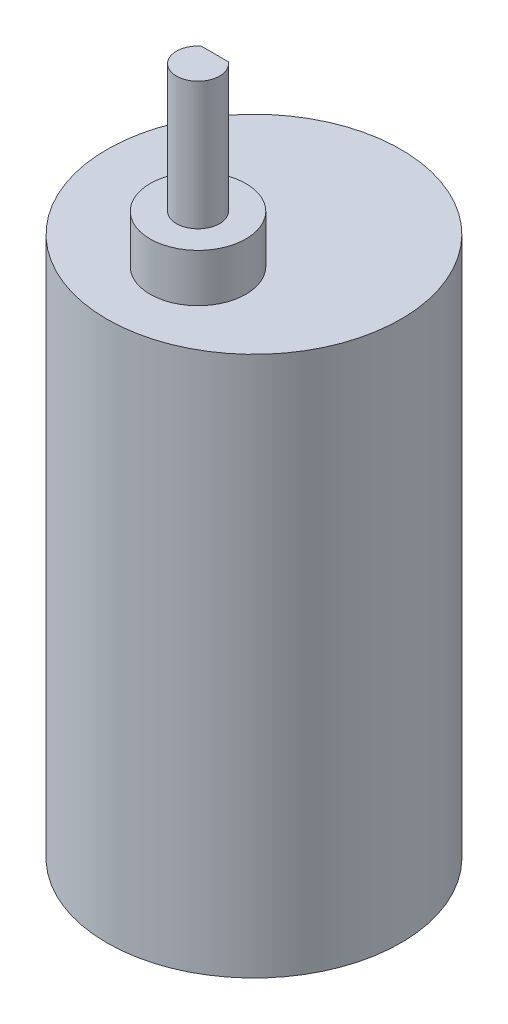
ISO-10303-21;
HEADER;
FILE_DESCRIPTION(('STEP AP214'),'2;1');
FILE_NAME('part.step','',(''),(''),'','','');
FILE_SCHEMA(('AUTOMOTIVE_DESIGN { 1 0 10303 214 1 1 1 1 }'));
ENDSEC;
DATA;
#1=APPLICATION_CONTEXT('core data for automotive mechanical design processes');
#2=APPLICATION_PROTOCOL_DEFINITION('international standard','automotive_design',2000,#1);
#3=PRODUCT_CONTEXT('',#1,'mechanical');
#4=PRODUCT('Part','Part','',(#3));
#5=PRODUCT_RELATED_PRODUCT_CATEGORY('part','',(#4));
#6=PRODUCT_DEFINITION_FORMATION('','',#4);
#7=PRODUCT_DEFINITION_CONTEXT('part definition',#1,'design');
#8=PRODUCT_DEFINITION('design','',#6,#7);
#9=PRODUCT_DEFINITION_SHAPE('','',#8);
#10=(LENGTH_UNIT() NAMED_UNIT(*) SI_UNIT(.MILLI.,.METRE.));
#11=(NAMED_UNIT(*) PLANE_ANGLE_UNIT() SI_UNIT($,.RADIAN.));
#12=(NAMED_UNIT(*) SI_UNIT($,.STERADIAN.) SOLID_ANGLE_UNIT());
#13=UNCERTAINTY_MEASURE_WITH_UNIT(LENGTH_MEASURE(1.E-05),#10,'distance_accuracy_value','');
#14=(GEOMETRIC_REPRESENTATION_CONTEXT(3) GLOBAL_UNCERTAINTY_ASSIGNED_CONTEXT((#13)) GLOBAL_UNIT_ASSIGNED_CONTEXT((#10,
#11,#12)) REPRESENTATION_CONTEXT('',''));
#15=CARTESIAN_POINT('',(0.,0.,0.));
#16=DIRECTION('',(0.,0.,1.));
#17=DIRECTION('',(1.,0.,0.));
#18=AXIS2_PLACEMENT_3D('',#15,#16,#17);
#19=CARTESIAN_POINT('',(0.,73.6,7.));
#20=DIRECTION('',(0.,1.,0.));
#21=DIRECTION('',(0.,0.,1.));
#22=AXIS2_PLACEMENT_3D('',#19,#20,#21);
#23=PLANE('',#22);
#24=CARTESIAN_POINT('',(0.,73.6,7.));
#25=DIRECTION('',(0.,1.,0.));
#26=DIRECTION('',(0.,0.,1.));
#27=AXIS2_PLACEMENT_3D('',#24,#25,#26);
#28=CIRCLE('',#27,6.);
#29=CARTESIAN_POINT('',(0.,73.6,13.));
#30=VERTEX_POINT('',#29);
#31=EDGE_CURVE('E85',#30,#30,#28,.T.);
#32=ORIENTED_EDGE('',*,*,#31,.T.);
#33=EDGE_LOOP('',(#32));
#34=FACE_BOUND('',#33,.T.);
#35=DIRECTION('',(1.,0.,0.));
#36=VECTOR('',#35,1.);
#37=CARTESIAN_POINT('',(0.,73.6,4.9));
#38=LINE('',#37,#36);
#39=CARTESIAN_POINT('',(-1.69705627484771,73.6,4.9));
#40=VERTEX_POINT('',#39);
#41=CARTESIAN_POINT('',(1.69705627484771,73.6,4.9));
#42=VERTEX_POINT('',#41);
#43=EDGE_CURVE('E48',#40,#42,#38,.T.);
#44=ORIENTED_EDGE('',*,*,#43,.T.);
#45=CARTESIAN_POINT('',(0.,73.6,7.));
#46=DIRECTION('',(0.,1.,0.));
#47=DIRECTION('',(0.,0.,1.));
#48=AXIS2_PLACEMENT_3D('',#45,#46,#47);
#49=CIRCLE('',#48,2.7);
#50=EDGE_CURVE('E11',#42,#40,#49,.F.);
#51=ORIENTED_EDGE('',*,*,#50,.T.);
#52=EDGE_LOOP('',(#44,#51));
#53=FACE_BOUND('',#52,.T.);
#54=ADVANCED_FACE('F39',(#34,#53),#23,.T.);
#55=CARTESIAN_POINT('',(0.,67.6,0.));
#56=DIRECTION('',(0.,-1.,0.));
#57=DIRECTION('',(0.,0.,-1.));
#58=AXIS2_PLACEMENT_3D('',#55,#56,#57);
#59=CYLINDRICAL_SURFACE('',#58,18.4);
#60=CARTESIAN_POINT('',(0.,67.6,0.));
#61=DIRECTION('',(0.,1.,0.));
#62=DIRECTION('',(0.,0.,1.));
#63=AXIS2_PLACEMENT_3D('',#60,#61,#62);
#64=CIRCLE('',#63,18.4);
#65=CARTESIAN_POINT('',(0.,67.6,18.4));
#66=VERTEX_POINT('',#65);
#67=EDGE_CURVE('E93',#66,#66,#64,.T.);
#68=ORIENTED_EDGE('',*,*,#67,.F.);
#69=EDGE_LOOP('',(#68));
#70=FACE_BOUND('',#69,.T.);
#71=CARTESIAN_POINT('',(0.,0.,0.));
#72=DIRECTION('',(0.,1.,0.));
#73=DIRECTION('',(0.,0.,1.));
#74=AXIS2_PLACEMENT_3D('',#71,#72,#73);
#75=CIRCLE('',#74,18.4);
#76=CARTESIAN_POINT('',(0.,0.,18.4));
#77=VERTEX_POINT('',#76);
#78=EDGE_CURVE('E91',#77,#77,#75,.T.);
#79=ORIENTED_EDGE('',*,*,#78,.T.);
#80=EDGE_LOOP('',(#79));
#81=FACE_BOUND('',#80,.T.);
#82=ADVANCED_FACE('F41',(#70,#81),#59,.T.);
#83=CARTESIAN_POINT('',(0.,67.6,0.));
#84=DIRECTION('',(0.,1.,0.));
#85=DIRECTION('',(0.,0.,1.));
#86=AXIS2_PLACEMENT_3D('',#83,#84,#85);
#87=PLANE('',#86);
#88=CARTESIAN_POINT('',(0.,67.6,7.));
#89=DIRECTION('',(0.,1.,0.));
#90=DIRECTION('',(0.,0.,1.));
#91=AXIS2_PLACEMENT_3D('',#88,#89,#90);
#92=CIRCLE('',#91,6.);
#93=CARTESIAN_POINT('',(0.,67.6,13.));
#94=VERTEX_POINT('',#93);
#95=EDGE_CURVE('E80',#94,#94,#92,.T.);
#96=ORIENTED_EDGE('',*,*,#95,.F.);
#97=EDGE_LOOP('',(#96));
#98=FACE_BOUND('',#97,.T.);
#99=ORIENTED_EDGE('',*,*,#67,.T.);
#100=EDGE_LOOP('',(#99));
#101=FACE_BOUND('',#100,.T.);
#102=ADVANCED_FACE('F107',(#98,#101),#87,.T.);
#103=CARTESIAN_POINT('',(0.,0.,0.));
#104=DIRECTION('',(0.,1.,0.));
#105=DIRECTION('',(0.,0.,1.));
#106=AXIS2_PLACEMENT_3D('',#103,#104,#105);
#107=PLANE('',#106);
#108=ORIENTED_EDGE('',*,*,#78,.F.);
#109=EDGE_LOOP('',(#108));
#110=FACE_BOUND('',#109,.T.);
#111=ADVANCED_FACE('F115',(#110),#107,.F.);
#112=CARTESIAN_POINT('',(0.,73.6,7.));
#113=DIRECTION('',(0.,-1.,0.));
#114=DIRECTION('',(0.,0.,-1.));
#115=AXIS2_PLACEMENT_3D('',#112,#113,#114);
#116=CYLINDRICAL_SURFACE('',#115,6.);
#117=ORIENTED_EDGE('',*,*,#31,.F.);
#118=EDGE_LOOP('',(#117));
#119=FACE_BOUND('',#118,.T.);
#120=ORIENTED_EDGE('',*,*,#95,.T.);
#121=EDGE_LOOP('',(#120));
#122=FACE_BOUND('',#121,.T.);
#123=ADVANCED_FACE('F112',(#119,#122),#116,.T.);
#124=CARTESIAN_POINT('',(0.,89.6,7.));
#125=DIRECTION('',(0.,-1.,0.));
#126=DIRECTION('',(0.,0.,-1.));
#127=AXIS2_PLACEMENT_3D('',#124,#125,#126);
#128=CYLINDRICAL_SURFACE('',#127,2.7);
#129=ORIENTED_EDGE('',*,*,#50,.F.);
#130=DIRECTION('',(0.,-1.,0.));
#131=VECTOR('',#130,1.);
#132=CARTESIAN_POINT('',(1.69705627484771,89.6,4.9));
#133=LINE('',#132,#131);
#134=CARTESIAN_POINT('',(1.69705627484771,89.6,4.9));
#135=VERTEX_POINT('',#134);
#136=EDGE_CURVE('E55',#135,#42,#133,.T.);
#137=ORIENTED_EDGE('',*,*,#136,.F.);
#138=CARTESIAN_POINT('',(0.,89.6,7.));
#139=DIRECTION('',(0.,1.,0.));
#140=DIRECTION('',(0.,0.,1.));
#141=AXIS2_PLACEMENT_3D('',#138,#139,#140);
#142=CIRCLE('',#141,2.7);
#143=CARTESIAN_POINT('',(-1.69705627484771,89.6,4.9));
#144=VERTEX_POINT('',#143);
#145=EDGE_CURVE('E72',#144,#135,#142,.T.);
#146=ORIENTED_EDGE('',*,*,#145,.F.);
#147=DIRECTION('',(0.,-1.,0.));
#148=VECTOR('',#147,1.);
#149=CARTESIAN_POINT('',(-1.69705627484771,89.6,4.9));
#150=LINE('',#149,#148);
#151=EDGE_CURVE('E68',#144,#40,#150,.T.);
#152=ORIENTED_EDGE('',*,*,#151,.T.);
#153=EDGE_LOOP('',(#129,#137,#146,#152));
#154=FACE_BOUND('',#153,.T.);
#155=ADVANCED_FACE('F78',(#154),#128,.T.);
#156=CARTESIAN_POINT('',(0.,89.6,4.9));
#157=DIRECTION('',(0.,0.,1.));
#158=DIRECTION('',(1.,0.,0.));
#159=AXIS2_PLACEMENT_3D('',#156,#157,#158);
#160=PLANE('',#159);
#161=ORIENTED_EDGE('',*,*,#43,.F.);
#162=ORIENTED_EDGE('',*,*,#151,.F.);
#163=DIRECTION('',(-1.,0.,0.));
#164=VECTOR('',#163,1.);
#165=CARTESIAN_POINT('',(0.,89.6,4.9));
#166=LINE('',#165,#164);
#167=EDGE_CURVE('E65',#135,#144,#166,.T.);
#168=ORIENTED_EDGE('',*,*,#167,.F.);
#169=ORIENTED_EDGE('',*,*,#136,.T.);
#170=EDGE_LOOP('',(#161,#162,#168,#169));
#171=FACE_BOUND('',#170,.T.);
#172=ADVANCED_FACE('F67',(#171),#160,.F.);
#173=CARTESIAN_POINT('',(0.,89.6,7.));
#174=DIRECTION('',(0.,1.,0.));
#175=DIRECTION('',(0.,0.,1.));
#176=AXIS2_PLACEMENT_3D('',#173,#174,#175);
#177=PLANE('',#176);
#178=ORIENTED_EDGE('',*,*,#145,.T.);
#179=ORIENTED_EDGE('',*,*,#167,.T.);
#180=EDGE_LOOP('',(#178,#179));
#181=FACE_BOUND('',#180,.T.);
#182=ADVANCED_FACE('F74',(#181),#177,.T.);
#183=CLOSED_SHELL('',(#54,#82,#102,#111,#123,#155,#172,#182));
#184=MANIFOLD_SOLID_BREP('B2',#183);
#185=ADVANCED_BREP_SHAPE_REPRESENTATION('',(#18,#184),#14);
#186=SHAPE_DEFINITION_REPRESENTATION(#9,#185);
ENDSEC;
END-ISO-10303-21;
